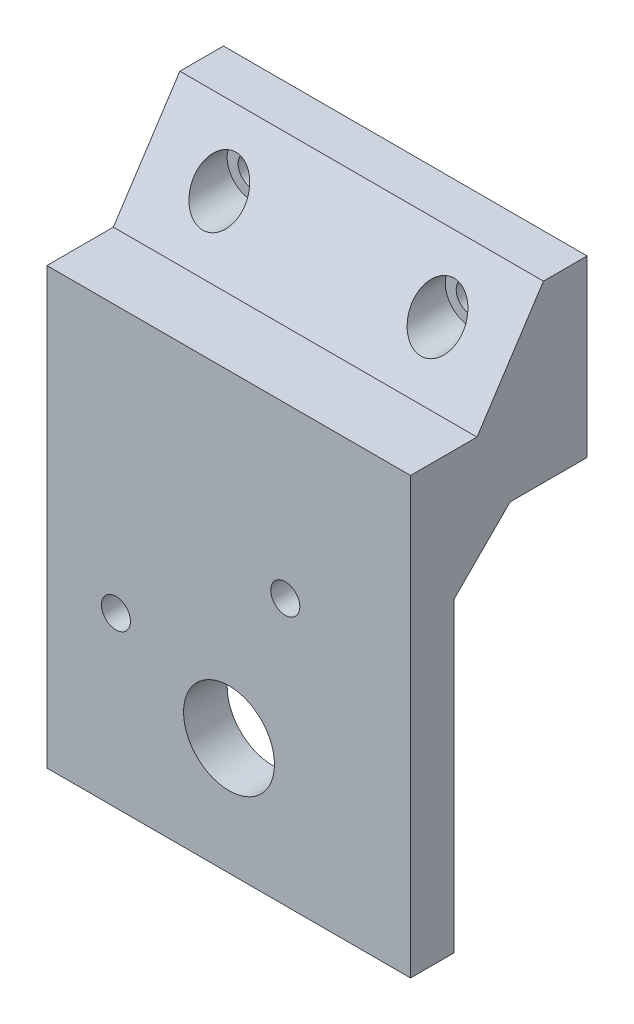
ISO-10303-21;
HEADER;
FILE_DESCRIPTION(('STEP AP214'),'2;1');
FILE_NAME('part.step','',(''),(''),'','','');
FILE_SCHEMA(('AUTOMOTIVE_DESIGN { 1 0 10303 214 1 1 1 1 }'));
ENDSEC;
DATA;
#1=APPLICATION_CONTEXT('core data for automotive mechanical design processes');
#2=APPLICATION_PROTOCOL_DEFINITION('international standard','automotive_design',2000,#1);
#3=PRODUCT_CONTEXT('',#1,'mechanical');
#4=PRODUCT('Part','Part','',(#3));
#5=PRODUCT_RELATED_PRODUCT_CATEGORY('part','',(#4));
#6=PRODUCT_DEFINITION_FORMATION('','',#4);
#7=PRODUCT_DEFINITION_CONTEXT('part definition',#1,'design');
#8=PRODUCT_DEFINITION('design','',#6,#7);
#9=PRODUCT_DEFINITION_SHAPE('','',#8);
#10=(LENGTH_UNIT() NAMED_UNIT(*) SI_UNIT(.MILLI.,.METRE.));
#11=(NAMED_UNIT(*) PLANE_ANGLE_UNIT() SI_UNIT($,.RADIAN.));
#12=(NAMED_UNIT(*) SI_UNIT($,.STERADIAN.) SOLID_ANGLE_UNIT());
#13=UNCERTAINTY_MEASURE_WITH_UNIT(LENGTH_MEASURE(1.E-05),#10,'distance_accuracy_value','');
#14=(GEOMETRIC_REPRESENTATION_CONTEXT(3) GLOBAL_UNCERTAINTY_ASSIGNED_CONTEXT((#13)) GLOBAL_UNIT_ASSIGNED_CONTEXT((#10,
#11,#12)) REPRESENTATION_CONTEXT('',''));
#15=CARTESIAN_POINT('',(0.,0.,0.));
#16=DIRECTION('',(0.,0.,1.));
#17=DIRECTION('',(1.,0.,0.));
#18=AXIS2_PLACEMENT_3D('',#15,#16,#17);
#19=CARTESIAN_POINT('',(-37.3940677966102,-64.9544915254237,7.7));
#20=DIRECTION('',(0.,0.,1.));
#21=DIRECTION('',(1.,0.,0.));
#22=AXIS2_PLACEMENT_3D('',#19,#20,#21);
#23=PLANE('',#22);
#24=CARTESIAN_POINT('',(-12.3549482946976,-48.8793900681752,7.7));
#25=DIRECTION('',(0.,0.,-1.));
#26=DIRECTION('',(-1.,0.,0.));
#27=AXIS2_PLACEMENT_3D('',#24,#25,#26);
#28=CIRCLE('',#27,6.25);
#29=CARTESIAN_POINT('',(-18.6049482946976,-48.8793900681752,7.7));
#30=VERTEX_POINT('',#29);
#31=EDGE_CURVE('E486',#30,#30,#28,.T.);
#32=ORIENTED_EDGE('',*,*,#31,.F.);
#33=EDGE_LOOP('',(#32));
#34=FACE_BOUND('',#33,.T.);
#35=DIRECTION('',(0.,1.,0.));
#36=VECTOR('',#35,1.);
#37=CARTESIAN_POINT('',(12.6059322033898,-64.9544915254237,7.69999999999999));
#38=LINE('',#37,#36);
#39=CARTESIAN_POINT('',(12.6059322033898,-64.9544915254237,7.69999999999999));
#40=VERTEX_POINT('',#39);
#41=CARTESIAN_POINT('',(12.6059322033898,-22.8123463658713,7.7));
#42=VERTEX_POINT('',#41);
#43=EDGE_CURVE('E141',#40,#42,#38,.T.);
#44=ORIENTED_EDGE('',*,*,#43,.F.);
#45=DIRECTION('',(1.,0.,0.));
#46=VECTOR('',#45,1.);
#47=CARTESIAN_POINT('',(-37.3940677966102,-64.9544915254237,7.7));
#48=LINE('',#47,#46);
#49=CARTESIAN_POINT('',(-37.3940677966102,-64.9544915254237,7.7));
#50=VERTEX_POINT('',#49);
#51=EDGE_CURVE('E149',#50,#40,#48,.T.);
#52=ORIENTED_EDGE('',*,*,#51,.F.);
#53=DIRECTION('',(0.,1.,0.));
#54=VECTOR('',#53,1.);
#55=CARTESIAN_POINT('',(-37.3940677966102,-64.9544915254237,7.7));
#56=LINE('',#55,#54);
#57=CARTESIAN_POINT('',(-37.3940677966102,-22.8123463658712,7.7));
#58=VERTEX_POINT('',#57);
#59=EDGE_CURVE('E146',#50,#58,#56,.T.);
#60=ORIENTED_EDGE('',*,*,#59,.T.);
#61=DIRECTION('',(-1.,0.,0.));
#62=VECTOR('',#61,1.);
#63=CARTESIAN_POINT('',(12.6059322033898,-22.8123463658713,7.7));
#64=LINE('',#63,#62);
#65=EDGE_CURVE('E186',#42,#58,#64,.T.);
#66=ORIENTED_EDGE('',*,*,#65,.F.);
#67=EDGE_LOOP('',(#44,#52,#60,#66));
#68=FACE_BOUND('',#67,.T.);
#69=CARTESIAN_POINT('',(-4.61668756949044,-28.3707157826755,7.7));
#70=DIRECTION('',(0.,0.,-1.));
#71=DIRECTION('',(-1.,0.,0.));
#72=AXIS2_PLACEMENT_3D('',#69,#70,#71);
#73=CIRCLE('',#72,2.);
#74=CARTESIAN_POINT('',(-6.61668756949044,-28.3707157826755,7.7));
#75=VERTEX_POINT('',#74);
#76=EDGE_CURVE('E160',#75,#75,#73,.T.);
#77=ORIENTED_EDGE('',*,*,#76,.F.);
#78=EDGE_LOOP('',(#77));
#79=FACE_BOUND('',#78,.T.);
#80=CARTESIAN_POINT('',(-27.9010287653283,-41.7569338906564,7.7));
#81=DIRECTION('',(0.,0.,-1.));
#82=DIRECTION('',(-1.,0.,0.));
#83=AXIS2_PLACEMENT_3D('',#80,#81,#82);
#84=CIRCLE('',#83,2.);
#85=CARTESIAN_POINT('',(-29.9010287653283,-41.7569338906564,7.7));
#86=VERTEX_POINT('',#85);
#87=EDGE_CURVE('E11',#86,#86,#84,.T.);
#88=ORIENTED_EDGE('',*,*,#87,.F.);
#89=EDGE_LOOP('',(#88));
#90=FACE_BOUND('',#89,.T.);
#91=ADVANCED_FACE('F33',(#34,#68,#79,#90),#23,.F.);
#92=CARTESIAN_POINT('',(-37.3940677966102,10.9555084745763,7.));
#93=DIRECTION('',(1.,0.,0.));
#94=DIRECTION('',(0.,1.,0.));
#95=AXIS2_PLACEMENT_3D('',#92,#93,#94);
#96=PLANE('',#95);
#97=DIRECTION('',(0.,0.,1.));
#98=VECTOR('',#97,1.);
#99=CARTESIAN_POINT('',(-37.3940677966102,-5.11234636587132,13.7));
#100=LINE('',#99,#98);
#101=CARTESIAN_POINT('',(-37.3940677966102,-5.11234636587132,4.56));
#102=VERTEX_POINT('',#101);
#103=CARTESIAN_POINT('',(-37.3940677966102,-5.11234636587132,13.7));
#104=VERTEX_POINT('',#103);
#105=EDGE_CURVE('E76',#102,#104,#100,.T.);
#106=ORIENTED_EDGE('',*,*,#105,.F.);
#107=DIRECTION('',(0.,0.837348730034215,-0.546669099465195));
#108=VECTOR('',#107,1.);
#109=CARTESIAN_POINT('',(-37.3940677966102,-5.11234636587132,4.56));
#110=LINE('',#109,#108);
#111=CARTESIAN_POINT('',(-37.3940677966102,8.88765363412868,-4.58));
#112=VERTEX_POINT('',#111);
#113=EDGE_CURVE('E120',#102,#112,#110,.T.);
#114=ORIENTED_EDGE('',*,*,#113,.T.);
#115=DIRECTION('',(0.,0.,1.));
#116=VECTOR('',#115,1.);
#117=CARTESIAN_POINT('',(-37.3940677966102,8.88765363412868,-10.58));
#118=LINE('',#117,#116);
#119=CARTESIAN_POINT('',(-37.3940677966102,8.88765363412868,-10.58));
#120=VERTEX_POINT('',#119);
#121=EDGE_CURVE('E200',#120,#112,#118,.T.);
#122=ORIENTED_EDGE('',*,*,#121,.F.);
#123=DIRECTION('',(0.,1.,0.));
#124=VECTOR('',#123,1.);
#125=CARTESIAN_POINT('',(-37.3940677966102,-5.11234636587132,-10.58));
#126=LINE('',#125,#124);
#127=CARTESIAN_POINT('',(-37.3940677966102,-15.1123463658713,-10.58));
#128=VERTEX_POINT('',#127);
#129=EDGE_CURVE('E205',#128,#120,#126,.T.);
#130=ORIENTED_EDGE('',*,*,#129,.F.);
#131=DIRECTION('',(0.,0.,1.));
#132=VECTOR('',#131,1.);
#133=CARTESIAN_POINT('',(-37.3940677966102,-15.1123463658713,-10.58));
#134=LINE('',#133,#132);
#135=CARTESIAN_POINT('',(-37.3940677966102,-15.1123463658713,0.));
#136=VERTEX_POINT('',#135);
#137=EDGE_CURVE('E136',#128,#136,#134,.T.);
#138=ORIENTED_EDGE('',*,*,#137,.T.);
#139=DIRECTION('',(0.,-0.707106781186544,0.707106781186551));
#140=VECTOR('',#139,1.);
#141=CARTESIAN_POINT('',(-37.3940677966102,-15.1123463658713,0.));
#142=LINE('',#141,#140);
#143=EDGE_CURVE('E122',#136,#58,#142,.T.);
#144=ORIENTED_EDGE('',*,*,#143,.T.);
#145=ORIENTED_EDGE('',*,*,#59,.F.);
#146=DIRECTION('',(0.,0.,-1.));
#147=VECTOR('',#146,1.);
#148=CARTESIAN_POINT('',(-37.3940677966102,-64.9544915254237,13.7));
#149=LINE('',#148,#147);
#150=CARTESIAN_POINT('',(-37.3940677966102,-64.9544915254237,13.7));
#151=VERTEX_POINT('',#150);
#152=EDGE_CURVE('E143',#151,#50,#149,.T.);
#153=ORIENTED_EDGE('',*,*,#152,.F.);
#154=DIRECTION('',(0.,-1.,0.));
#155=VECTOR('',#154,1.);
#156=CARTESIAN_POINT('',(-37.3940677966102,10.9555084745763,13.7));
#157=LINE('',#156,#155);
#158=EDGE_CURVE('E144',#104,#151,#157,.T.);
#159=ORIENTED_EDGE('',*,*,#158,.F.);
#160=EDGE_LOOP('',(#106,#114,#122,#130,#138,#144,#145,#153,#159));
#161=FACE_BOUND('',#160,.T.);
#162=ADVANCED_FACE('F35',(#161),#96,.F.);
#163=CARTESIAN_POINT('',(12.6059322033898,10.9555084745763,7.));
#164=DIRECTION('',(-1.,0.,0.));
#165=DIRECTION('',(0.,-1.,0.));
#166=AXIS2_PLACEMENT_3D('',#163,#164,#165);
#167=PLANE('',#166);
#168=DIRECTION('',(0.,0.837348730034215,-0.546669099465195));
#169=VECTOR('',#168,1.);
#170=CARTESIAN_POINT('',(12.6059322033899,-5.11234636587134,4.56));
#171=LINE('',#170,#169);
#172=CARTESIAN_POINT('',(12.6059322033899,-5.11234636587134,4.56));
#173=VERTEX_POINT('',#172);
#174=CARTESIAN_POINT('',(12.6059322033898,8.88765363412866,-4.58000000000001));
#175=VERTEX_POINT('',#174);
#176=EDGE_CURVE('E117',#173,#175,#171,.T.);
#177=ORIENTED_EDGE('',*,*,#176,.F.);
#178=DIRECTION('',(0.,0.,-1.));
#179=VECTOR('',#178,1.);
#180=CARTESIAN_POINT('',(12.6059322033898,-5.11234636587134,13.7));
#181=LINE('',#180,#179);
#182=CARTESIAN_POINT('',(12.6059322033898,-5.11234636587134,13.7));
#183=VERTEX_POINT('',#182);
#184=EDGE_CURVE('E126',#183,#173,#181,.T.);
#185=ORIENTED_EDGE('',*,*,#184,.F.);
#186=DIRECTION('',(0.,1.,0.));
#187=VECTOR('',#186,1.);
#188=CARTESIAN_POINT('',(12.6059322033898,10.9555084745763,13.7));
#189=LINE('',#188,#187);
#190=CARTESIAN_POINT('',(12.6059322033898,-64.9544915254237,13.7));
#191=VERTEX_POINT('',#190);
#192=EDGE_CURVE('E65',#191,#183,#189,.T.);
#193=ORIENTED_EDGE('',*,*,#192,.F.);
#194=DIRECTION('',(0.,0.,1.));
#195=VECTOR('',#194,1.);
#196=CARTESIAN_POINT('',(12.6059322033898,-64.9544915254237,13.7));
#197=LINE('',#196,#195);
#198=EDGE_CURVE('E153',#40,#191,#197,.T.);
#199=ORIENTED_EDGE('',*,*,#198,.F.);
#200=ORIENTED_EDGE('',*,*,#43,.T.);
#201=DIRECTION('',(0.,-0.707106781186544,0.707106781186551));
#202=VECTOR('',#201,1.);
#203=CARTESIAN_POINT('',(12.6059322033898,-15.1123463658713,0.));
#204=LINE('',#203,#202);
#205=CARTESIAN_POINT('',(12.6059322033898,-15.1123463658713,0.));
#206=VERTEX_POINT('',#205);
#207=EDGE_CURVE('E181',#206,#42,#204,.T.);
#208=ORIENTED_EDGE('',*,*,#207,.F.);
#209=DIRECTION('',(0.,0.,1.));
#210=VECTOR('',#209,1.);
#211=CARTESIAN_POINT('',(12.6059322033898,-15.1123463658713,-10.58));
#212=LINE('',#211,#210);
#213=CARTESIAN_POINT('',(12.6059322033898,-15.1123463658713,-10.58));
#214=VERTEX_POINT('',#213);
#215=EDGE_CURVE('E132',#214,#206,#212,.T.);
#216=ORIENTED_EDGE('',*,*,#215,.F.);
#217=DIRECTION('',(0.,-1.,0.));
#218=VECTOR('',#217,1.);
#219=CARTESIAN_POINT('',(12.6059322033898,-5.11234636587132,-10.58));
#220=LINE('',#219,#218);
#221=CARTESIAN_POINT('',(12.6059322033898,8.88765363412866,-10.58));
#222=VERTEX_POINT('',#221);
#223=EDGE_CURVE('E207',#222,#214,#220,.T.);
#224=ORIENTED_EDGE('',*,*,#223,.F.);
#225=DIRECTION('',(0.,0.,-1.));
#226=VECTOR('',#225,1.);
#227=CARTESIAN_POINT('',(12.6059322033898,8.88765363412866,-10.58));
#228=LINE('',#227,#226);
#229=EDGE_CURVE('E128',#175,#222,#228,.T.);
#230=ORIENTED_EDGE('',*,*,#229,.F.);
#231=EDGE_LOOP('',(#177,#185,#193,#199,#200,#208,#216,#224,#230));
#232=FACE_BOUND('',#231,.T.);
#233=ADVANCED_FACE('F125',(#232),#167,.F.);
#234=CARTESIAN_POINT('',(0.,-64.9544915254237,0.));
#235=DIRECTION('',(0.,-1.,0.));
#236=DIRECTION('',(0.,0.,-1.));
#237=AXIS2_PLACEMENT_3D('',#234,#235,#236);
#238=PLANE('',#237);
#239=DIRECTION('',(-1.,0.,0.));
#240=VECTOR('',#239,1.);
#241=CARTESIAN_POINT('',(-37.3940677966102,-64.9544915254237,13.7));
#242=LINE('',#241,#240);
#243=EDGE_CURVE('E52',#191,#151,#242,.T.);
#244=ORIENTED_EDGE('',*,*,#243,.T.);
#245=ORIENTED_EDGE('',*,*,#152,.T.);
#246=ORIENTED_EDGE('',*,*,#51,.T.);
#247=ORIENTED_EDGE('',*,*,#198,.T.);
#248=EDGE_LOOP('',(#244,#245,#246,#247));
#249=FACE_BOUND('',#248,.T.);
#250=ADVANCED_FACE('F228',(#249),#238,.T.);
#251=CARTESIAN_POINT('',(0.,0.,13.7));
#252=DIRECTION('',(0.,0.,1.));
#253=DIRECTION('',(1.,0.,0.));
#254=AXIS2_PLACEMENT_3D('',#251,#252,#253);
#255=PLANE('',#254);
#256=CARTESIAN_POINT('',(-12.3549482946976,-48.8793900681752,13.7));
#257=DIRECTION('',(0.,0.,1.));
#258=DIRECTION('',(1.,0.,0.));
#259=AXIS2_PLACEMENT_3D('',#256,#257,#258);
#260=CIRCLE('',#259,6.25);
#261=CARTESIAN_POINT('',(-6.10494829469764,-48.8793900681752,13.7));
#262=VERTEX_POINT('',#261);
#263=EDGE_CURVE('E37',#262,#262,#260,.T.);
#264=ORIENTED_EDGE('',*,*,#263,.F.);
#265=EDGE_LOOP('',(#264));
#266=FACE_BOUND('',#265,.T.);
#267=ORIENTED_EDGE('',*,*,#158,.T.);
#268=ORIENTED_EDGE('',*,*,#243,.F.);
#269=ORIENTED_EDGE('',*,*,#192,.T.);
#270=DIRECTION('',(1.,0.,0.));
#271=VECTOR('',#270,1.);
#272=CARTESIAN_POINT('',(12.6059322033898,-5.11234636587134,13.7));
#273=LINE('',#272,#271);
#274=EDGE_CURVE('E131',#104,#183,#273,.T.);
#275=ORIENTED_EDGE('',*,*,#274,.F.);
#276=EDGE_LOOP('',(#267,#268,#269,#275));
#277=FACE_BOUND('',#276,.T.);
#278=CARTESIAN_POINT('',(-27.9010287653283,-41.7569338906564,13.7));
#279=DIRECTION('',(0.,0.,1.));
#280=DIRECTION('',(1.,0.,0.));
#281=AXIS2_PLACEMENT_3D('',#278,#279,#280);
#282=CIRCLE('',#281,2.);
#283=CARTESIAN_POINT('',(-25.9010287653283,-41.7569338906564,13.7));
#284=VERTEX_POINT('',#283);
#285=EDGE_CURVE('E43',#284,#284,#282,.T.);
#286=ORIENTED_EDGE('',*,*,#285,.F.);
#287=EDGE_LOOP('',(#286));
#288=FACE_BOUND('',#287,.T.);
#289=CARTESIAN_POINT('',(-4.61668756949044,-28.3707157826755,13.7));
#290=DIRECTION('',(0.,0.,1.));
#291=DIRECTION('',(1.,0.,0.));
#292=AXIS2_PLACEMENT_3D('',#289,#290,#291);
#293=CIRCLE('',#292,2.);
#294=CARTESIAN_POINT('',(-2.61668756949044,-28.3707157826755,13.7));
#295=VERTEX_POINT('',#294);
#296=EDGE_CURVE('E157',#295,#295,#293,.T.);
#297=ORIENTED_EDGE('',*,*,#296,.F.);
#298=EDGE_LOOP('',(#297));
#299=FACE_BOUND('',#298,.T.);
#300=ADVANCED_FACE('F229',(#266,#277,#288,#299),#255,.T.);
#301=CARTESIAN_POINT('',(-4.61668756949044,-28.3707157826755,42.7));
#302=DIRECTION('',(0.,0.,-1.));
#303=DIRECTION('',(-1.,0.,0.));
#304=AXIS2_PLACEMENT_3D('',#301,#302,#303);
#305=CYLINDRICAL_SURFACE('',#304,2.);
#306=ORIENTED_EDGE('',*,*,#296,.T.);
#307=EDGE_LOOP('',(#306));
#308=FACE_BOUND('',#307,.T.);
#309=ORIENTED_EDGE('',*,*,#76,.T.);
#310=EDGE_LOOP('',(#309));
#311=FACE_BOUND('',#310,.T.);
#312=ADVANCED_FACE('F232',(#308,#311),#305,.F.);
#313=CARTESIAN_POINT('',(-27.9010287653283,-41.7569338906564,42.7));
#314=DIRECTION('',(0.,0.,-1.));
#315=DIRECTION('',(-1.,0.,0.));
#316=AXIS2_PLACEMENT_3D('',#313,#314,#315);
#317=CYLINDRICAL_SURFACE('',#316,2.);
#318=ORIENTED_EDGE('',*,*,#285,.T.);
#319=EDGE_LOOP('',(#318));
#320=FACE_BOUND('',#319,.T.);
#321=ORIENTED_EDGE('',*,*,#87,.T.);
#322=EDGE_LOOP('',(#321));
#323=FACE_BOUND('',#322,.T.);
#324=ADVANCED_FACE('F241',(#320,#323),#317,.F.);
#325=CARTESIAN_POINT('',(0.,-5.11234636587133,0.));
#326=DIRECTION('',(0.,1.,0.));
#327=DIRECTION('',(-1.,0.,0.));
#328=AXIS2_PLACEMENT_3D('',#325,#326,#327);
#329=PLANE('',#328);
#330=DIRECTION('',(-1.,0.,0.));
#331=VECTOR('',#330,1.);
#332=CARTESIAN_POINT('',(12.6059322033899,-5.11234636587134,4.56));
#333=LINE('',#332,#331);
#334=EDGE_CURVE('E114',#173,#102,#333,.T.);
#335=ORIENTED_EDGE('',*,*,#334,.T.);
#336=ORIENTED_EDGE('',*,*,#105,.T.);
#337=ORIENTED_EDGE('',*,*,#274,.T.);
#338=ORIENTED_EDGE('',*,*,#184,.T.);
#339=EDGE_LOOP('',(#335,#336,#337,#338));
#340=FACE_BOUND('',#339,.T.);
#341=ADVANCED_FACE('F130',(#340),#329,.T.);
#342=CARTESIAN_POINT('',(-37.3940677966102,-15.1123463658713,-10.58));
#343=DIRECTION('',(0.,1.,0.));
#344=DIRECTION('',(-1.,0.,0.));
#345=AXIS2_PLACEMENT_3D('',#342,#343,#344);
#346=PLANE('',#345);
#347=ORIENTED_EDGE('',*,*,#215,.T.);
#348=DIRECTION('',(-1.,0.,0.));
#349=VECTOR('',#348,1.);
#350=CARTESIAN_POINT('',(12.6059322033898,-15.1123463658713,0.));
#351=LINE('',#350,#349);
#352=EDGE_CURVE('E183',#206,#136,#351,.T.);
#353=ORIENTED_EDGE('',*,*,#352,.T.);
#354=ORIENTED_EDGE('',*,*,#137,.F.);
#355=DIRECTION('',(-1.,0.,0.));
#356=VECTOR('',#355,1.);
#357=CARTESIAN_POINT('',(-37.3940677966102,-15.1123463658713,-10.58));
#358=LINE('',#357,#356);
#359=EDGE_CURVE('E209',#214,#128,#358,.T.);
#360=ORIENTED_EDGE('',*,*,#359,.F.);
#361=EDGE_LOOP('',(#347,#353,#354,#360));
#362=FACE_BOUND('',#361,.T.);
#363=ADVANCED_FACE('F218',(#362),#346,.F.);
#364=CARTESIAN_POINT('',(0.,0.,-10.58));
#365=DIRECTION('',(0.,0.,1.));
#366=DIRECTION('',(1.,0.,0.));
#367=AXIS2_PLACEMENT_3D('',#364,#365,#366);
#368=PLANE('',#367);
#369=CARTESIAN_POINT('',(2.60593220338985,1.88765363412868,-10.58));
#370=DIRECTION('',(0.,0.,1.));
#371=DIRECTION('',(1.,0.,0.));
#372=AXIS2_PLACEMENT_3D('',#369,#370,#371);
#373=CIRCLE('',#372,2.);
#374=CARTESIAN_POINT('',(4.60593220338985,1.88765363412868,-10.58));
#375=VERTEX_POINT('',#374);
#376=EDGE_CURVE('E193',#375,#375,#373,.T.);
#377=ORIENTED_EDGE('',*,*,#376,.T.);
#378=EDGE_LOOP('',(#377));
#379=FACE_BOUND('',#378,.T.);
#380=CARTESIAN_POINT('',(-27.3940677966102,1.88765363412868,-10.58));
#381=DIRECTION('',(0.,0.,1.));
#382=DIRECTION('',(1.,0.,0.));
#383=AXIS2_PLACEMENT_3D('',#380,#381,#382);
#384=CIRCLE('',#383,2.);
#385=CARTESIAN_POINT('',(-25.3940677966102,1.88765363412868,-10.58));
#386=VERTEX_POINT('',#385);
#387=EDGE_CURVE('E188',#386,#386,#384,.T.);
#388=ORIENTED_EDGE('',*,*,#387,.T.);
#389=EDGE_LOOP('',(#388));
#390=FACE_BOUND('',#389,.T.);
#391=ORIENTED_EDGE('',*,*,#129,.T.);
#392=DIRECTION('',(-1.,0.,0.));
#393=VECTOR('',#392,1.);
#394=CARTESIAN_POINT('',(12.6059322033898,8.88765363412866,-10.58));
#395=LINE('',#394,#393);
#396=EDGE_CURVE('E197',#222,#120,#395,.T.);
#397=ORIENTED_EDGE('',*,*,#396,.F.);
#398=ORIENTED_EDGE('',*,*,#223,.T.);
#399=ORIENTED_EDGE('',*,*,#359,.T.);
#400=EDGE_LOOP('',(#391,#397,#398,#399));
#401=FACE_BOUND('',#400,.T.);
#402=ADVANCED_FACE('F275',(#379,#390,#401),#368,.F.);
#403=CARTESIAN_POINT('',(0.,8.88765363412867,0.));
#404=DIRECTION('',(0.,-1.,0.));
#405=DIRECTION('',(1.,0.,0.));
#406=AXIS2_PLACEMENT_3D('',#403,#404,#405);
#407=PLANE('',#406);
#408=ORIENTED_EDGE('',*,*,#229,.T.);
#409=ORIENTED_EDGE('',*,*,#396,.T.);
#410=ORIENTED_EDGE('',*,*,#121,.T.);
#411=DIRECTION('',(1.,0.,0.));
#412=VECTOR('',#411,1.);
#413=CARTESIAN_POINT('',(12.6059322033898,8.88765363412866,-4.58000000000001));
#414=LINE('',#413,#412);
#415=EDGE_CURVE('E203',#112,#175,#414,.T.);
#416=ORIENTED_EDGE('',*,*,#415,.T.);
#417=EDGE_LOOP('',(#408,#409,#410,#416));
#418=FACE_BOUND('',#417,.T.);
#419=ADVANCED_FACE('F383',(#418),#407,.F.);
#420=CARTESIAN_POINT('',(-27.3940677966102,1.88765363412868,-18.58));
#421=DIRECTION('',(0.,0.,1.));
#422=DIRECTION('',(1.,0.,0.));
#423=AXIS2_PLACEMENT_3D('',#420,#421,#422);
#424=CYLINDRICAL_SURFACE('',#423,2.);
#425=CARTESIAN_POINT('',(-27.3940677966102,1.88765363412868,-4.58));
#426=DIRECTION('',(0.,0.,-1.));
#427=DIRECTION('',(-1.,0.,0.));
#428=AXIS2_PLACEMENT_3D('',#425,#426,#427);
#429=CIRCLE('',#428,2.);
#430=CARTESIAN_POINT('',(-29.3940677966102,1.88765363412868,-4.58));
#431=VERTEX_POINT('',#430);
#432=EDGE_CURVE('E170',#431,#431,#429,.F.);
#433=ORIENTED_EDGE('',*,*,#432,.T.);
#434=EDGE_LOOP('',(#433));
#435=FACE_BOUND('',#434,.T.);
#436=ORIENTED_EDGE('',*,*,#387,.F.);
#437=EDGE_LOOP('',(#436));
#438=FACE_BOUND('',#437,.T.);
#439=ADVANCED_FACE('F394',(#435,#438),#424,.F.);
#440=CARTESIAN_POINT('',(2.60593220338985,1.88765363412868,-18.58));
#441=DIRECTION('',(0.,0.,1.));
#442=DIRECTION('',(1.,0.,0.));
#443=AXIS2_PLACEMENT_3D('',#440,#441,#442);
#444=CYLINDRICAL_SURFACE('',#443,2.);
#445=CARTESIAN_POINT('',(2.60593220338985,1.88765363412868,-4.58));
#446=DIRECTION('',(0.,0.,-1.));
#447=DIRECTION('',(-1.,0.,0.));
#448=AXIS2_PLACEMENT_3D('',#445,#446,#447);
#449=CIRCLE('',#448,2.);
#450=CARTESIAN_POINT('',(0.605932203389848,1.88765363412868,-4.58));
#451=VERTEX_POINT('',#450);
#452=EDGE_CURVE('E174',#451,#451,#449,.F.);
#453=ORIENTED_EDGE('',*,*,#452,.T.);
#454=EDGE_LOOP('',(#453));
#455=FACE_BOUND('',#454,.T.);
#456=ORIENTED_EDGE('',*,*,#376,.F.);
#457=EDGE_LOOP('',(#456));
#458=FACE_BOUND('',#457,.T.);
#459=ADVANCED_FACE('F403',(#455,#458),#444,.F.);
#460=CARTESIAN_POINT('',(12.6059322033898,-15.1123463658713,0.));
#461=DIRECTION('',(0.,-0.707106781186551,-0.707106781186544));
#462=DIRECTION('',(0.,0.707106781186544,-0.707106781186551));
#463=AXIS2_PLACEMENT_3D('',#460,#461,#462);
#464=PLANE('',#463);
#465=ORIENTED_EDGE('',*,*,#143,.F.);
#466=ORIENTED_EDGE('',*,*,#352,.F.);
#467=ORIENTED_EDGE('',*,*,#207,.T.);
#468=ORIENTED_EDGE('',*,*,#65,.T.);
#469=EDGE_LOOP('',(#465,#466,#467,#468));
#470=FACE_BOUND('',#469,.T.);
#471=ADVANCED_FACE('F222',(#470),#464,.T.);
#472=CARTESIAN_POINT('',(12.6059322033899,-5.11234636587134,4.56));
#473=DIRECTION('',(0.,0.546669099465195,0.837348730034215));
#474=DIRECTION('',(0.,-0.837348730034215,0.546669099465195));
#475=AXIS2_PLACEMENT_3D('',#472,#473,#474);
#476=PLANE('',#475);
#477=CARTESIAN_POINT('',(-27.3940677966102,1.88765363412868,-0.0100000000000065));
#478=DIRECTION('',(0.,0.546669099465195,0.837348730034215));
#479=DIRECTION('',(0.,0.837348730034215,-0.546669099465195));
#480=AXIS2_PLACEMENT_3D('',#477,#478,#479);
#481=ELLIPSE('',#480,4.17985944739772,3.5);
#482=CARTESIAN_POINT('',(-27.3940677966102,5.38765363412868,-2.29500000000001));
#483=VERTEX_POINT('',#482);
#484=EDGE_CURVE('E167',#483,#483,#481,.T.);
#485=ORIENTED_EDGE('',*,*,#484,.F.);
#486=EDGE_LOOP('',(#485));
#487=FACE_BOUND('',#486,.T.);
#488=CARTESIAN_POINT('',(2.60593220338985,1.88765363412868,-0.0100000000000135));
#489=DIRECTION('',(0.,0.546669099465195,0.837348730034215));
#490=DIRECTION('',(0.,0.837348730034215,-0.546669099465195));
#491=AXIS2_PLACEMENT_3D('',#488,#489,#490);
#492=ELLIPSE('',#491,4.17985944739772,3.5);
#493=CARTESIAN_POINT('',(2.60593220338985,5.38765363412868,-2.29500000000001));
#494=VERTEX_POINT('',#493);
#495=EDGE_CURVE('E165',#494,#494,#492,.T.);
#496=ORIENTED_EDGE('',*,*,#495,.F.);
#497=EDGE_LOOP('',(#496));
#498=FACE_BOUND('',#497,.T.);
#499=ORIENTED_EDGE('',*,*,#113,.F.);
#500=ORIENTED_EDGE('',*,*,#334,.F.);
#501=ORIENTED_EDGE('',*,*,#176,.T.);
#502=ORIENTED_EDGE('',*,*,#415,.F.);
#503=EDGE_LOOP('',(#499,#500,#501,#502));
#504=FACE_BOUND('',#503,.T.);
#505=ADVANCED_FACE('F116',(#487,#498,#504),#476,.T.);
#506=CARTESIAN_POINT('',(2.60593220338985,1.88765363412868,-4.58));
#507=DIRECTION('',(0.,0.,-1.));
#508=DIRECTION('',(-1.,0.,0.));
#509=AXIS2_PLACEMENT_3D('',#506,#507,#508);
#510=PLANE('',#509);
#511=CARTESIAN_POINT('',(2.60593220338985,1.88765363412868,-4.58));
#512=DIRECTION('',(0.,0.,-1.));
#513=DIRECTION('',(-1.,0.,0.));
#514=AXIS2_PLACEMENT_3D('',#511,#512,#513);
#515=CIRCLE('',#514,3.5);
#516=CARTESIAN_POINT('',(-0.894067796610152,1.88765363412868,-4.58));
#517=VERTEX_POINT('',#516);
#518=EDGE_CURVE('E488',#517,#517,#515,.T.);
#519=ORIENTED_EDGE('',*,*,#518,.F.);
#520=EDGE_LOOP('',(#519));
#521=FACE_BOUND('',#520,.T.);
#522=ORIENTED_EDGE('',*,*,#452,.F.);
#523=EDGE_LOOP('',(#522));
#524=FACE_BOUND('',#523,.T.);
#525=ADVANCED_FACE('F427',(#521,#524),#510,.F.);
#526=CARTESIAN_POINT('',(2.60593220338985,1.88765363412868,9.42));
#527=DIRECTION('',(0.,0.,-1.));
#528=DIRECTION('',(-1.,0.,0.));
#529=AXIS2_PLACEMENT_3D('',#526,#527,#528);
#530=CYLINDRICAL_SURFACE('',#529,3.5);
#531=ORIENTED_EDGE('',*,*,#495,.T.);
#532=EDGE_LOOP('',(#531));
#533=FACE_BOUND('',#532,.T.);
#534=ORIENTED_EDGE('',*,*,#518,.T.);
#535=EDGE_LOOP('',(#534));
#536=FACE_BOUND('',#535,.T.);
#537=ADVANCED_FACE('F435',(#533,#536),#530,.F.);
#538=CARTESIAN_POINT('',(-27.3940677966102,1.88765363412868,-4.58));
#539=DIRECTION('',(0.,0.,-1.));
#540=DIRECTION('',(-1.,0.,0.));
#541=AXIS2_PLACEMENT_3D('',#538,#539,#540);
#542=PLANE('',#541);
#543=CARTESIAN_POINT('',(-27.3940677966102,1.88765363412868,-4.58));
#544=DIRECTION('',(0.,0.,-1.));
#545=DIRECTION('',(-1.,0.,0.));
#546=AXIS2_PLACEMENT_3D('',#543,#544,#545);
#547=CIRCLE('',#546,3.5);
#548=CARTESIAN_POINT('',(-30.8940677966102,1.88765363412868,-4.58));
#549=VERTEX_POINT('',#548);
#550=EDGE_CURVE('E168',#549,#549,#547,.T.);
#551=ORIENTED_EDGE('',*,*,#550,.F.);
#552=EDGE_LOOP('',(#551));
#553=FACE_BOUND('',#552,.T.);
#554=ORIENTED_EDGE('',*,*,#432,.F.);
#555=EDGE_LOOP('',(#554));
#556=FACE_BOUND('',#555,.T.);
#557=ADVANCED_FACE('F443',(#553,#556),#542,.F.);
#558=CARTESIAN_POINT('',(-27.3940677966102,1.88765363412868,9.42));
#559=DIRECTION('',(0.,0.,-1.));
#560=DIRECTION('',(-1.,0.,0.));
#561=AXIS2_PLACEMENT_3D('',#558,#559,#560);
#562=CYLINDRICAL_SURFACE('',#561,3.5);
#563=ORIENTED_EDGE('',*,*,#484,.T.);
#564=EDGE_LOOP('',(#563));
#565=FACE_BOUND('',#564,.T.);
#566=ORIENTED_EDGE('',*,*,#550,.T.);
#567=EDGE_LOOP('',(#566));
#568=FACE_BOUND('',#567,.T.);
#569=ADVANCED_FACE('F451',(#565,#568),#562,.F.);
#570=CARTESIAN_POINT('',(-12.3549482946976,-48.8793900681752,17.7));
#571=DIRECTION('',(0.,0.,-1.));
#572=DIRECTION('',(-1.,0.,0.));
#573=AXIS2_PLACEMENT_3D('',#570,#571,#572);
#574=CYLINDRICAL_SURFACE('',#573,6.25);
#575=ORIENTED_EDGE('',*,*,#263,.T.);
#576=EDGE_LOOP('',(#575));
#577=FACE_BOUND('',#576,.T.);
#578=ORIENTED_EDGE('',*,*,#31,.T.);
#579=EDGE_LOOP('',(#578));
#580=FACE_BOUND('',#579,.T.);
#581=ADVANCED_FACE('F458',(#577,#580),#574,.F.);
#582=CLOSED_SHELL('',(#91,#162,#233,#250,#300,#312,#324,#341,#363,#402,#419,#439,#459,#471,#505,
#525,#537,#557,#569,#581));
#583=MANIFOLD_SOLID_BREP('B2',#582);
#584=ADVANCED_BREP_SHAPE_REPRESENTATION('',(#18,#583),#14);
#585=SHAPE_DEFINITION_REPRESENTATION(#9,#584);
ENDSEC;
END-ISO-10303-21;
